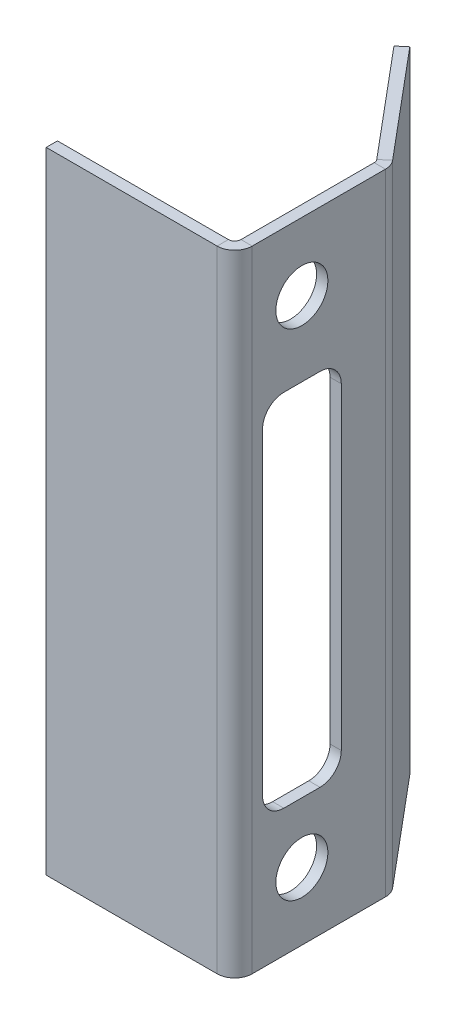
ISO-10303-21;
HEADER;
FILE_DESCRIPTION(('STEP AP214'),'2;1');
FILE_NAME('part.step','',(''),(''),'','','');
FILE_SCHEMA(('AUTOMOTIVE_DESIGN { 1 0 10303 214 1 1 1 1 }'));
ENDSEC;
DATA;
#1=APPLICATION_CONTEXT('core data for automotive mechanical design processes');
#2=APPLICATION_PROTOCOL_DEFINITION('international standard','automotive_design',2000,#1);
#3=PRODUCT_CONTEXT('',#1,'mechanical');
#4=PRODUCT('Part','Part','',(#3));
#5=PRODUCT_RELATED_PRODUCT_CATEGORY('part','',(#4));
#6=PRODUCT_DEFINITION_FORMATION('','',#4);
#7=PRODUCT_DEFINITION_CONTEXT('part definition',#1,'design');
#8=PRODUCT_DEFINITION('design','',#6,#7);
#9=PRODUCT_DEFINITION_SHAPE('','',#8);
#10=(LENGTH_UNIT() NAMED_UNIT(*) SI_UNIT(.MILLI.,.METRE.));
#11=(NAMED_UNIT(*) PLANE_ANGLE_UNIT() SI_UNIT($,.RADIAN.));
#12=(NAMED_UNIT(*) SI_UNIT($,.STERADIAN.) SOLID_ANGLE_UNIT());
#13=UNCERTAINTY_MEASURE_WITH_UNIT(LENGTH_MEASURE(1.E-05),#10,'distance_accuracy_value','');
#14=(GEOMETRIC_REPRESENTATION_CONTEXT(3) GLOBAL_UNCERTAINTY_ASSIGNED_CONTEXT((#13)) GLOBAL_UNIT_ASSIGNED_CONTEXT((#10,
#11,#12)) REPRESENTATION_CONTEXT('',''));
#15=CARTESIAN_POINT('',(0.,0.,0.));
#16=DIRECTION('',(0.,0.,1.));
#17=DIRECTION('',(1.,0.,0.));
#18=AXIS2_PLACEMENT_3D('',#15,#16,#17);
#19=CARTESIAN_POINT('',(25.,88.9,-0.889));
#20=DIRECTION('',(0.,1.,0.));
#21=DIRECTION('',(0.,0.,1.));
#22=AXIS2_PLACEMENT_3D('',#19,#20,#21);
#23=PLANE('',#22);
#24=DIRECTION('',(1.,0.,0.));
#25=VECTOR('',#24,1.);
#26=CARTESIAN_POINT('',(25.,88.9,-0.889));
#27=LINE('',#26,#25);
#28=CARTESIAN_POINT('',(25.,88.9,-0.889));
#29=VERTEX_POINT('',#28);
#30=CARTESIAN_POINT('',(26.5875,88.9,-0.889));
#31=VERTEX_POINT('',#30);
#32=EDGE_CURVE('E312',#29,#31,#27,.T.);
#33=ORIENTED_EDGE('',*,*,#32,.F.);
#34=CARTESIAN_POINT('',(24.111,88.9,-0.889));
#35=DIRECTION('',(0.,-1.,0.));
#36=DIRECTION('',(0.,0.,-1.));
#37=AXIS2_PLACEMENT_3D('',#34,#35,#36);
#38=CIRCLE('',#37,0.889);
#39=CARTESIAN_POINT('',(24.111,88.9,0.));
#40=VERTEX_POINT('',#39);
#41=EDGE_CURVE('E219',#40,#29,#38,.F.);
#42=ORIENTED_EDGE('',*,*,#41,.F.);
#43=DIRECTION('',(0.,0.,-1.));
#44=VECTOR('',#43,1.);
#45=CARTESIAN_POINT('',(24.111,88.9,1.5875));
#46=LINE('',#45,#44);
#47=CARTESIAN_POINT('',(24.111,88.9,1.5875));
#48=VERTEX_POINT('',#47);
#49=EDGE_CURVE('E310',#48,#40,#46,.T.);
#50=ORIENTED_EDGE('',*,*,#49,.F.);
#51=CARTESIAN_POINT('',(24.111,88.9,-0.889));
#52=DIRECTION('',(0.,1.,0.));
#53=DIRECTION('',(1.,0.,0.));
#54=AXIS2_PLACEMENT_3D('',#51,#52,#53);
#55=CIRCLE('',#54,2.4765);
#56=EDGE_CURVE('E231',#48,#31,#55,.T.);
#57=ORIENTED_EDGE('',*,*,#56,.T.);
#58=EDGE_LOOP('',(#33,#42,#50,#57));
#59=FACE_BOUND('',#58,.T.);
#60=ADVANCED_FACE('F45',(#59),#23,.T.);
#61=CARTESIAN_POINT('',(24.111,88.9,1.5875));
#62=DIRECTION('',(0.,1.,0.));
#63=DIRECTION('',(0.,0.,1.));
#64=AXIS2_PLACEMENT_3D('',#61,#62,#63);
#65=PLANE('',#64);
#66=DIRECTION('',(0.,0.,-1.));
#67=VECTOR('',#66,1.);
#68=CARTESIAN_POINT('',(25.,88.9,0.));
#69=LINE('',#68,#67);
#70=CARTESIAN_POINT('',(25.,88.9,-19.6764304617373));
#71=VERTEX_POINT('',#70);
#72=EDGE_CURVE('E216',#29,#71,#69,.T.);
#73=ORIENTED_EDGE('',*,*,#72,.F.);
#74=ORIENTED_EDGE('',*,*,#32,.T.);
#75=DIRECTION('',(0.,0.,-1.));
#76=VECTOR('',#75,1.);
#77=CARTESIAN_POINT('',(26.5875,88.9,0.));
#78=LINE('',#77,#76);
#79=CARTESIAN_POINT('',(26.5875,88.9,-19.6764304617373));
#80=VERTEX_POINT('',#79);
#81=EDGE_CURVE('E234',#31,#80,#78,.T.);
#82=ORIENTED_EDGE('',*,*,#81,.T.);
#83=DIRECTION('',(-1.,0.,0.));
#84=VECTOR('',#83,1.);
#85=CARTESIAN_POINT('',(26.5875,88.9,-19.6764304617373));
#86=LINE('',#85,#84);
#87=EDGE_CURVE('E303',#80,#71,#86,.T.);
#88=ORIENTED_EDGE('',*,*,#87,.T.);
#89=EDGE_LOOP('',(#73,#74,#82,#88));
#90=FACE_BOUND('',#89,.T.);
#91=ADVANCED_FACE('F419',(#90),#65,.T.);
#92=CARTESIAN_POINT('',(24.111,0.,0.));
#93=DIRECTION('',(0.,-1.,0.));
#94=DIRECTION('',(0.,0.,-1.));
#95=AXIS2_PLACEMENT_3D('',#92,#93,#94);
#96=PLANE('',#95);
#97=DIRECTION('',(0.,0.,1.));
#98=VECTOR('',#97,1.);
#99=CARTESIAN_POINT('',(24.111,0.,0.));
#100=LINE('',#99,#98);
#101=CARTESIAN_POINT('',(24.111,0.,0.));
#102=VERTEX_POINT('',#101);
#103=CARTESIAN_POINT('',(24.111,0.,1.5875));
#104=VERTEX_POINT('',#103);
#105=EDGE_CURVE('E308',#102,#104,#100,.T.);
#106=ORIENTED_EDGE('',*,*,#105,.F.);
#107=CARTESIAN_POINT('',(24.111,0.,-0.889));
#108=DIRECTION('',(0.,-1.,0.));
#109=DIRECTION('',(0.,0.,-1.));
#110=AXIS2_PLACEMENT_3D('',#107,#108,#109);
#111=CIRCLE('',#110,0.889);
#112=CARTESIAN_POINT('',(25.,0.,-0.889));
#113=VERTEX_POINT('',#112);
#114=EDGE_CURVE('E253',#102,#113,#111,.F.);
#115=ORIENTED_EDGE('',*,*,#114,.T.);
#116=DIRECTION('',(-1.,0.,0.));
#117=VECTOR('',#116,1.);
#118=CARTESIAN_POINT('',(26.5875,0.,-0.889));
#119=LINE('',#118,#117);
#120=CARTESIAN_POINT('',(26.5875,0.,-0.889));
#121=VERTEX_POINT('',#120);
#122=EDGE_CURVE('E306',#121,#113,#119,.T.);
#123=ORIENTED_EDGE('',*,*,#122,.F.);
#124=CARTESIAN_POINT('',(24.111,0.,-0.889));
#125=DIRECTION('',(0.,1.,0.));
#126=DIRECTION('',(1.,0.,0.));
#127=AXIS2_PLACEMENT_3D('',#124,#125,#126);
#128=CIRCLE('',#127,2.4765);
#129=EDGE_CURVE('E265',#104,#121,#128,.T.);
#130=ORIENTED_EDGE('',*,*,#129,.F.);
#131=EDGE_LOOP('',(#106,#115,#123,#130));
#132=FACE_BOUND('',#131,.T.);
#133=ADVANCED_FACE('F425',(#132),#96,.T.);
#134=CARTESIAN_POINT('',(26.5875,0.,-0.889));
#135=DIRECTION('',(0.,-1.,0.));
#136=DIRECTION('',(0.,0.,-1.));
#137=AXIS2_PLACEMENT_3D('',#134,#135,#136);
#138=PLANE('',#137);
#139=DIRECTION('',(1.,0.,0.));
#140=VECTOR('',#139,1.);
#141=CARTESIAN_POINT('',(0.,0.,0.));
#142=LINE('',#141,#140);
#143=CARTESIAN_POINT('',(0.,0.,0.));
#144=VERTEX_POINT('',#143);
#145=EDGE_CURVE('E256',#144,#102,#142,.T.);
#146=ORIENTED_EDGE('',*,*,#145,.T.);
#147=ORIENTED_EDGE('',*,*,#105,.T.);
#148=DIRECTION('',(1.,0.,0.));
#149=VECTOR('',#148,1.);
#150=CARTESIAN_POINT('',(0.,0.,1.5875));
#151=LINE('',#150,#149);
#152=CARTESIAN_POINT('',(0.,0.,1.5875));
#153=VERTEX_POINT('',#152);
#154=EDGE_CURVE('E262',#153,#104,#151,.T.);
#155=ORIENTED_EDGE('',*,*,#154,.F.);
#156=DIRECTION('',(0.,0.,-1.));
#157=VECTOR('',#156,1.);
#158=CARTESIAN_POINT('',(0.,0.,1.5875));
#159=LINE('',#158,#157);
#160=EDGE_CURVE('E259',#153,#144,#159,.T.);
#161=ORIENTED_EDGE('',*,*,#160,.T.);
#162=EDGE_LOOP('',(#146,#147,#155,#161));
#163=FACE_BOUND('',#162,.T.);
#164=ADVANCED_FACE('F501',(#163),#138,.T.);
#165=CARTESIAN_POINT('',(24.7920135099328,88.9,-20.2478686467487));
#166=DIRECTION('',(0.,1.,0.));
#167=DIRECTION('',(0.,0.,1.));
#168=AXIS2_PLACEMENT_3D('',#165,#166,#167);
#169=PLANE('',#168);
#170=DIRECTION('',(0.766044443118977,0.,-0.642787609686541));
#171=VECTOR('',#170,1.);
#172=CARTESIAN_POINT('',(24.7920135099328,88.9,-20.2478686467487));
#173=LINE('',#172,#171);
#174=CARTESIAN_POINT('',(24.7920135099328,88.9,-20.2478686467487));
#175=VERTEX_POINT('',#174);
#176=CARTESIAN_POINT('',(26.0081090633841,88.9,-21.2682939771261));
#177=VERTEX_POINT('',#176);
#178=EDGE_CURVE('E190',#175,#177,#173,.T.);
#179=ORIENTED_EDGE('',*,*,#178,.F.);
#180=CARTESIAN_POINT('',(24.111,88.9,-19.6764304617373));
#181=DIRECTION('',(0.,-1.,0.));
#182=DIRECTION('',(0.,0.,-1.));
#183=AXIS2_PLACEMENT_3D('',#180,#181,#182);
#184=CIRCLE('',#183,0.889);
#185=EDGE_CURVE('E210',#71,#175,#184,.F.);
#186=ORIENTED_EDGE('',*,*,#185,.F.);
#187=ORIENTED_EDGE('',*,*,#87,.F.);
#188=CARTESIAN_POINT('',(24.111,88.9,-19.6764304617373));
#189=DIRECTION('',(0.,1.,0.));
#190=DIRECTION('',(1.,0.,0.));
#191=AXIS2_PLACEMENT_3D('',#188,#189,#190);
#192=CIRCLE('',#191,2.4765);
#193=EDGE_CURVE('E237',#80,#177,#192,.T.);
#194=ORIENTED_EDGE('',*,*,#193,.T.);
#195=EDGE_LOOP('',(#179,#186,#187,#194));
#196=FACE_BOUND('',#195,.T.);
#197=ADVANCED_FACE('F518',(#196),#169,.T.);
#198=CARTESIAN_POINT('',(26.5875,88.9,-19.6764304617373));
#199=DIRECTION('',(0.,1.,0.));
#200=DIRECTION('',(0.,0.,1.));
#201=AXIS2_PLACEMENT_3D('',#198,#199,#200);
#202=PLANE('',#201);
#203=DIRECTION('',(-0.64278760968654,0.,-0.766044443118977));
#204=VECTOR('',#203,1.);
#205=CARTESIAN_POINT('',(25.,88.9,-20.));
#206=LINE('',#205,#204);
#207=CARTESIAN_POINT('',(12.1442478062692,88.9,-35.3208888623796));
#208=VERTEX_POINT('',#207);
#209=EDGE_CURVE('E208',#175,#208,#206,.T.);
#210=ORIENTED_EDGE('',*,*,#209,.F.);
#211=ORIENTED_EDGE('',*,*,#178,.T.);
#212=DIRECTION('',(-0.64278760968654,0.,-0.766044443118977));
#213=VECTOR('',#212,1.);
#214=CARTESIAN_POINT('',(26.2160955534514,88.9,-21.0204253303774));
#215=LINE('',#214,#213);
#216=CARTESIAN_POINT('',(13.3603433597206,88.9,-36.3413141927569));
#217=VERTEX_POINT('',#216);
#218=EDGE_CURVE('E183',#177,#217,#215,.T.);
#219=ORIENTED_EDGE('',*,*,#218,.T.);
#220=DIRECTION('',(0.766044443118973,0.,-0.642787609686545));
#221=VECTOR('',#220,1.);
#222=CARTESIAN_POINT('',(12.1442478062692,88.9,-35.3208888623796));
#223=LINE('',#222,#221);
#224=EDGE_CURVE('E188',#208,#217,#223,.T.);
#225=ORIENTED_EDGE('',*,*,#224,.F.);
#226=EDGE_LOOP('',(#210,#211,#219,#225));
#227=FACE_BOUND('',#226,.T.);
#228=ADVANCED_FACE('F186',(#227),#202,.T.);
#229=CARTESIAN_POINT('',(25.,0.,-19.6764304617373));
#230=DIRECTION('',(0.,-1.,0.));
#231=DIRECTION('',(0.,0.,-1.));
#232=AXIS2_PLACEMENT_3D('',#229,#230,#231);
#233=PLANE('',#232);
#234=DIRECTION('',(1.,0.,0.));
#235=VECTOR('',#234,1.);
#236=CARTESIAN_POINT('',(25.,0.,-19.6764304617373));
#237=LINE('',#236,#235);
#238=CARTESIAN_POINT('',(25.,0.,-19.6764304617373));
#239=VERTEX_POINT('',#238);
#240=CARTESIAN_POINT('',(26.5875,0.,-19.6764304617373));
#241=VERTEX_POINT('',#240);
#242=EDGE_CURVE('E301',#239,#241,#237,.T.);
#243=ORIENTED_EDGE('',*,*,#242,.F.);
#244=CARTESIAN_POINT('',(24.111,0.,-19.6764304617373));
#245=DIRECTION('',(0.,-1.,0.));
#246=DIRECTION('',(0.,0.,-1.));
#247=AXIS2_PLACEMENT_3D('',#244,#245,#246);
#248=CIRCLE('',#247,0.889);
#249=CARTESIAN_POINT('',(24.7920135099328,0.,-20.2478686467487));
#250=VERTEX_POINT('',#249);
#251=EDGE_CURVE('E247',#239,#250,#248,.F.);
#252=ORIENTED_EDGE('',*,*,#251,.T.);
#253=DIRECTION('',(-0.766044443118977,0.,0.642787609686541));
#254=VECTOR('',#253,1.);
#255=CARTESIAN_POINT('',(26.0081090633841,0.,-21.2682939771261));
#256=LINE('',#255,#254);
#257=CARTESIAN_POINT('',(26.0081090633841,0.,-21.2682939771261));
#258=VERTEX_POINT('',#257);
#259=EDGE_CURVE('E204',#258,#250,#256,.T.);
#260=ORIENTED_EDGE('',*,*,#259,.F.);
#261=CARTESIAN_POINT('',(24.111,0.,-19.6764304617373));
#262=DIRECTION('',(0.,1.,0.));
#263=DIRECTION('',(1.,0.,0.));
#264=AXIS2_PLACEMENT_3D('',#261,#262,#263);
#265=CIRCLE('',#264,2.4765);
#266=EDGE_CURVE('E194',#241,#258,#265,.T.);
#267=ORIENTED_EDGE('',*,*,#266,.F.);
#268=EDGE_LOOP('',(#243,#252,#260,#267));
#269=FACE_BOUND('',#268,.T.);
#270=ADVANCED_FACE('F480',(#269),#233,.T.);
#271=CARTESIAN_POINT('',(26.0081090633841,0.,-21.2682939771261));
#272=DIRECTION('',(0.,-1.,0.));
#273=DIRECTION('',(0.,0.,-1.));
#274=AXIS2_PLACEMENT_3D('',#271,#272,#273);
#275=PLANE('',#274);
#276=DIRECTION('',(0.,0.,-1.));
#277=VECTOR('',#276,1.);
#278=CARTESIAN_POINT('',(25.,0.,0.));
#279=LINE('',#278,#277);
#280=EDGE_CURVE('E250',#113,#239,#279,.T.);
#281=ORIENTED_EDGE('',*,*,#280,.T.);
#282=ORIENTED_EDGE('',*,*,#242,.T.);
#283=DIRECTION('',(0.,0.,-1.));
#284=VECTOR('',#283,1.);
#285=CARTESIAN_POINT('',(26.5875,0.,0.));
#286=LINE('',#285,#284);
#287=EDGE_CURVE('E268',#121,#241,#286,.T.);
#288=ORIENTED_EDGE('',*,*,#287,.F.);
#289=ORIENTED_EDGE('',*,*,#122,.T.);
#290=EDGE_LOOP('',(#281,#282,#288,#289));
#291=FACE_BOUND('',#290,.T.);
#292=ADVANCED_FACE('F488',(#291),#275,.T.);
#293=CARTESIAN_POINT('',(26.2160955534514,88.9,-21.0204253303774));
#294=DIRECTION('',(-0.766044443118977,0.,0.64278760968654));
#295=DIRECTION('',(0.64278760968654,0.,0.766044443118977));
#296=AXIS2_PLACEMENT_3D('',#293,#294,#295);
#297=PLANE('',#296);
#298=DIRECTION('',(-0.64278760968654,0.,-0.766044443118977));
#299=VECTOR('',#298,1.);
#300=CARTESIAN_POINT('',(26.2160955534514,0.,-21.0204253303774));
#301=LINE('',#300,#299);
#302=CARTESIAN_POINT('',(13.3603433597206,0.,-36.3413141927569));
#303=VERTEX_POINT('',#302);
#304=EDGE_CURVE('E200',#258,#303,#301,.T.);
#305=ORIENTED_EDGE('',*,*,#304,.T.);
#306=DIRECTION('',(0.,-1.,0.));
#307=VECTOR('',#306,1.);
#308=CARTESIAN_POINT('',(13.3603433597206,88.9,-36.3413141927569));
#309=LINE('',#308,#307);
#310=EDGE_CURVE('E197',#217,#303,#309,.T.);
#311=ORIENTED_EDGE('',*,*,#310,.F.);
#312=ORIENTED_EDGE('',*,*,#218,.F.);
#313=DIRECTION('',(0.,-1.,0.));
#314=VECTOR('',#313,1.);
#315=CARTESIAN_POINT('',(26.0081090633841,88.9,-21.2682939771261));
#316=LINE('',#315,#314);
#317=EDGE_CURVE('E239',#177,#258,#316,.T.);
#318=ORIENTED_EDGE('',*,*,#317,.T.);
#319=EDGE_LOOP('',(#305,#311,#312,#318));
#320=FACE_BOUND('',#319,.T.);
#321=ADVANCED_FACE('F198',(#320),#297,.F.);
#322=CARTESIAN_POINT('',(12.1442478062692,88.9,-35.3208888623796));
#323=DIRECTION('',(-0.642787609686545,0.,-0.766044443118973));
#324=DIRECTION('',(-0.766044443118973,0.,0.642787609686545));
#325=AXIS2_PLACEMENT_3D('',#322,#323,#324);
#326=PLANE('',#325);
#327=DIRECTION('',(0.766044443118973,0.,-0.642787609686545));
#328=VECTOR('',#327,1.);
#329=CARTESIAN_POINT('',(12.1442478062692,0.,-35.3208888623796));
#330=LINE('',#329,#328);
#331=CARTESIAN_POINT('',(12.1442478062692,0.,-35.3208888623796));
#332=VERTEX_POINT('',#331);
#333=EDGE_CURVE('E241',#332,#303,#330,.T.);
#334=ORIENTED_EDGE('',*,*,#333,.F.);
#335=DIRECTION('',(0.,-1.,0.));
#336=VECTOR('',#335,1.);
#337=CARTESIAN_POINT('',(12.1442478062692,88.9,-35.3208888623796));
#338=LINE('',#337,#336);
#339=EDGE_CURVE('E205',#208,#332,#338,.T.);
#340=ORIENTED_EDGE('',*,*,#339,.F.);
#341=ORIENTED_EDGE('',*,*,#224,.T.);
#342=ORIENTED_EDGE('',*,*,#310,.T.);
#343=EDGE_LOOP('',(#334,#340,#341,#342));
#344=FACE_BOUND('',#343,.T.);
#345=ADVANCED_FACE('F207',(#344),#326,.T.);
#346=CARTESIAN_POINT('',(25.,88.9,-20.));
#347=DIRECTION('',(-0.766044443118977,0.,0.64278760968654));
#348=DIRECTION('',(0.64278760968654,0.,0.766044443118977));
#349=AXIS2_PLACEMENT_3D('',#346,#347,#348);
#350=PLANE('',#349);
#351=DIRECTION('',(-0.64278760968654,0.,-0.766044443118977));
#352=VECTOR('',#351,1.);
#353=CARTESIAN_POINT('',(25.,0.,-20.));
#354=LINE('',#353,#352);
#355=EDGE_CURVE('E244',#250,#332,#354,.T.);
#356=ORIENTED_EDGE('',*,*,#355,.F.);
#357=DIRECTION('',(0.,-1.,0.));
#358=VECTOR('',#357,1.);
#359=CARTESIAN_POINT('',(24.7920135099328,88.9,-20.2478686467487));
#360=LINE('',#359,#358);
#361=EDGE_CURVE('E296',#175,#250,#360,.T.);
#362=ORIENTED_EDGE('',*,*,#361,.F.);
#363=ORIENTED_EDGE('',*,*,#209,.T.);
#364=ORIENTED_EDGE('',*,*,#339,.T.);
#365=EDGE_LOOP('',(#356,#362,#363,#364));
#366=FACE_BOUND('',#365,.T.);
#367=ADVANCED_FACE('F477',(#366),#350,.T.);
#368=CARTESIAN_POINT('',(24.111,88.9,-19.6764304617373));
#369=DIRECTION('',(0.,-1.,0.));
#370=DIRECTION('',(0.,0.,-1.));
#371=AXIS2_PLACEMENT_3D('',#368,#369,#370);
#372=CYLINDRICAL_SURFACE('',#371,0.889);
#373=ORIENTED_EDGE('',*,*,#251,.F.);
#374=DIRECTION('',(0.,-1.,0.));
#375=VECTOR('',#374,1.);
#376=CARTESIAN_POINT('',(25.,88.9,-19.6764304617373));
#377=LINE('',#376,#375);
#378=EDGE_CURVE('E293',#71,#239,#377,.T.);
#379=ORIENTED_EDGE('',*,*,#378,.F.);
#380=ORIENTED_EDGE('',*,*,#185,.T.);
#381=ORIENTED_EDGE('',*,*,#361,.T.);
#382=EDGE_LOOP('',(#373,#379,#380,#381));
#383=FACE_BOUND('',#382,.T.);
#384=ADVANCED_FACE('F484',(#383),#372,.F.);
#385=CARTESIAN_POINT('',(25.,88.9,0.));
#386=DIRECTION('',(-1.,0.,0.));
#387=DIRECTION('',(0.,0.,1.));
#388=AXIS2_PLACEMENT_3D('',#385,#386,#387);
#389=PLANE('',#388);
#390=CARTESIAN_POINT('',(25.,79.35,-7.889));
#391=DIRECTION('',(-1.,0.,0.));
#392=DIRECTION('',(0.,0.,1.));
#393=AXIS2_PLACEMENT_3D('',#390,#391,#392);
#394=CIRCLE('',#393,3.66775026423711);
#395=CARTESIAN_POINT('',(25.,79.35,-4.22124973576289));
#396=VERTEX_POINT('',#395);
#397=EDGE_CURVE('E390',#396,#396,#394,.F.);
#398=ORIENTED_EDGE('',*,*,#397,.T.);
#399=EDGE_LOOP('',(#398));
#400=FACE_BOUND('',#399,.T.);
#401=CARTESIAN_POINT('',(25.,9.5,-7.88900000000001));
#402=DIRECTION('',(-1.,0.,0.));
#403=DIRECTION('',(0.,0.,1.));
#404=AXIS2_PLACEMENT_3D('',#401,#402,#403);
#405=CIRCLE('',#404,3.6677502642371);
#406=CARTESIAN_POINT('',(25.,9.5,-4.2212497357629));
#407=VERTEX_POINT('',#406);
#408=EDGE_CURVE('E386',#407,#407,#405,.F.);
#409=ORIENTED_EDGE('',*,*,#408,.T.);
#410=EDGE_LOOP('',(#409));
#411=FACE_BOUND('',#410,.T.);
#412=DIRECTION('',(0.,0.,-1.));
#413=VECTOR('',#412,1.);
#414=CARTESIAN_POINT('',(25.,18.0059352004911,-2.34731461555023));
#415=LINE('',#414,#413);
#416=CARTESIAN_POINT('',(25.,18.0059352004911,-5.34731461555023));
#417=VERTEX_POINT('',#416);
#418=CARTESIAN_POINT('',(25.,18.0059352004911,-10.4471146155502));
#419=VERTEX_POINT('',#418);
#420=EDGE_CURVE('E380',#417,#419,#415,.T.);
#421=ORIENTED_EDGE('',*,*,#420,.T.);
#422=CARTESIAN_POINT('',(25.,21.0059352004911,-10.4471146155502));
#423=DIRECTION('',(-1.,0.,0.));
#424=DIRECTION('',(0.,0.,1.));
#425=AXIS2_PLACEMENT_3D('',#422,#423,#424);
#426=CIRCLE('',#425,3.);
#427=CARTESIAN_POINT('',(25.,21.0059352004911,-13.4471146155502));
#428=VERTEX_POINT('',#427);
#429=EDGE_CURVE('E67',#419,#428,#426,.F.);
#430=ORIENTED_EDGE('',*,*,#429,.T.);
#431=DIRECTION('',(0.,1.,0.));
#432=VECTOR('',#431,1.);
#433=CARTESIAN_POINT('',(25.,18.0059352004911,-13.4471146155502));
#434=LINE('',#433,#432);
#435=CARTESIAN_POINT('',(25.,65.805935200491,-13.4471146155502));
#436=VERTEX_POINT('',#435);
#437=EDGE_CURVE('E355',#428,#436,#434,.T.);
#438=ORIENTED_EDGE('',*,*,#437,.T.);
#439=CARTESIAN_POINT('',(25.,65.805935200491,-10.4471146155502));
#440=DIRECTION('',(-1.,0.,0.));
#441=DIRECTION('',(0.,0.,1.));
#442=AXIS2_PLACEMENT_3D('',#439,#440,#441);
#443=CIRCLE('',#442,3.);
#444=CARTESIAN_POINT('',(25.,68.805935200491,-10.4471146155502));
#445=VERTEX_POINT('',#444);
#446=EDGE_CURVE('E11',#436,#445,#443,.F.);
#447=ORIENTED_EDGE('',*,*,#446,.T.);
#448=DIRECTION('',(0.,0.,1.));
#449=VECTOR('',#448,1.);
#450=CARTESIAN_POINT('',(25.,68.805935200491,-2.34731461555023));
#451=LINE('',#450,#449);
#452=CARTESIAN_POINT('',(25.,68.805935200491,-5.34731461555023));
#453=VERTEX_POINT('',#452);
#454=EDGE_CURVE('E362',#445,#453,#451,.T.);
#455=ORIENTED_EDGE('',*,*,#454,.T.);
#456=CARTESIAN_POINT('',(25.,65.805935200491,-5.34731461555023));
#457=DIRECTION('',(-1.,0.,0.));
#458=DIRECTION('',(0.,0.,1.));
#459=AXIS2_PLACEMENT_3D('',#456,#457,#458);
#460=CIRCLE('',#459,3.);
#461=CARTESIAN_POINT('',(25.,65.805935200491,-2.34731461555023));
#462=VERTEX_POINT('',#461);
#463=EDGE_CURVE('E339',#453,#462,#460,.F.);
#464=ORIENTED_EDGE('',*,*,#463,.T.);
#465=DIRECTION('',(0.,-1.,0.));
#466=VECTOR('',#465,1.);
#467=CARTESIAN_POINT('',(25.,18.0059352004911,-2.34731461555023));
#468=LINE('',#467,#466);
#469=CARTESIAN_POINT('',(25.,21.0059352004911,-2.34731461555023));
#470=VERTEX_POINT('',#469);
#471=EDGE_CURVE('E381',#462,#470,#468,.T.);
#472=ORIENTED_EDGE('',*,*,#471,.T.);
#473=CARTESIAN_POINT('',(25.,21.0059352004911,-5.34731461555023));
#474=DIRECTION('',(-1.,0.,0.));
#475=DIRECTION('',(0.,0.,1.));
#476=AXIS2_PLACEMENT_3D('',#473,#474,#475);
#477=CIRCLE('',#476,3.);
#478=EDGE_CURVE('E335',#470,#417,#477,.F.);
#479=ORIENTED_EDGE('',*,*,#478,.T.);
#480=EDGE_LOOP('',(#421,#430,#438,#447,#455,#464,#472,#479));
#481=FACE_BOUND('',#480,.T.);
#482=ORIENTED_EDGE('',*,*,#280,.F.);
#483=DIRECTION('',(0.,-1.,0.));
#484=VECTOR('',#483,1.);
#485=CARTESIAN_POINT('',(25.,88.9,-0.889));
#486=LINE('',#485,#484);
#487=EDGE_CURVE('E290',#29,#113,#486,.T.);
#488=ORIENTED_EDGE('',*,*,#487,.F.);
#489=ORIENTED_EDGE('',*,*,#72,.T.);
#490=ORIENTED_EDGE('',*,*,#378,.T.);
#491=EDGE_LOOP('',(#482,#488,#489,#490));
#492=FACE_BOUND('',#491,.T.);
#493=ADVANCED_FACE('F360',(#400,#411,#481,#492),#389,.T.);
#494=CARTESIAN_POINT('',(24.111,88.9,-0.889));
#495=DIRECTION('',(0.,-1.,0.));
#496=DIRECTION('',(0.,0.,-1.));
#497=AXIS2_PLACEMENT_3D('',#494,#495,#496);
#498=CYLINDRICAL_SURFACE('',#497,0.889);
#499=ORIENTED_EDGE('',*,*,#114,.F.);
#500=DIRECTION('',(0.,-1.,0.));
#501=VECTOR('',#500,1.);
#502=CARTESIAN_POINT('',(24.111,88.9,0.));
#503=LINE('',#502,#501);
#504=EDGE_CURVE('E287',#40,#102,#503,.T.);
#505=ORIENTED_EDGE('',*,*,#504,.F.);
#506=ORIENTED_EDGE('',*,*,#41,.T.);
#507=ORIENTED_EDGE('',*,*,#487,.T.);
#508=EDGE_LOOP('',(#499,#505,#506,#507));
#509=FACE_BOUND('',#508,.T.);
#510=ADVANCED_FACE('F497',(#509),#498,.F.);
#511=CARTESIAN_POINT('',(0.,88.9,0.));
#512=DIRECTION('',(0.,0.,-1.));
#513=DIRECTION('',(-1.,0.,0.));
#514=AXIS2_PLACEMENT_3D('',#511,#512,#513);
#515=PLANE('',#514);
#516=ORIENTED_EDGE('',*,*,#145,.F.);
#517=DIRECTION('',(0.,-1.,0.));
#518=VECTOR('',#517,1.);
#519=CARTESIAN_POINT('',(0.,88.9,0.));
#520=LINE('',#519,#518);
#521=CARTESIAN_POINT('',(0.,88.9,0.));
#522=VERTEX_POINT('',#521);
#523=EDGE_CURVE('E285',#522,#144,#520,.T.);
#524=ORIENTED_EDGE('',*,*,#523,.F.);
#525=DIRECTION('',(1.,0.,0.));
#526=VECTOR('',#525,1.);
#527=CARTESIAN_POINT('',(0.,88.9,0.));
#528=LINE('',#527,#526);
#529=EDGE_CURVE('E222',#522,#40,#528,.T.);
#530=ORIENTED_EDGE('',*,*,#529,.T.);
#531=ORIENTED_EDGE('',*,*,#504,.T.);
#532=EDGE_LOOP('',(#516,#524,#530,#531));
#533=FACE_BOUND('',#532,.T.);
#534=ADVANCED_FACE('F505',(#533),#515,.T.);
#535=CARTESIAN_POINT('',(0.,88.9,1.5875));
#536=DIRECTION('',(-1.,0.,0.));
#537=DIRECTION('',(0.,0.,1.));
#538=AXIS2_PLACEMENT_3D('',#535,#536,#537);
#539=PLANE('',#538);
#540=ORIENTED_EDGE('',*,*,#160,.F.);
#541=DIRECTION('',(0.,-1.,0.));
#542=VECTOR('',#541,1.);
#543=CARTESIAN_POINT('',(0.,88.9,1.5875));
#544=LINE('',#543,#542);
#545=CARTESIAN_POINT('',(0.,88.9,1.5875));
#546=VERTEX_POINT('',#545);
#547=EDGE_CURVE('E283',#546,#153,#544,.T.);
#548=ORIENTED_EDGE('',*,*,#547,.F.);
#549=DIRECTION('',(0.,0.,-1.));
#550=VECTOR('',#549,1.);
#551=CARTESIAN_POINT('',(0.,88.9,1.5875));
#552=LINE('',#551,#550);
#553=EDGE_CURVE('E225',#546,#522,#552,.T.);
#554=ORIENTED_EDGE('',*,*,#553,.T.);
#555=ORIENTED_EDGE('',*,*,#523,.T.);
#556=EDGE_LOOP('',(#540,#548,#554,#555));
#557=FACE_BOUND('',#556,.T.);
#558=ADVANCED_FACE('F509',(#557),#539,.T.);
#559=CARTESIAN_POINT('',(0.,88.9,1.5875));
#560=DIRECTION('',(0.,0.,-1.));
#561=DIRECTION('',(-1.,0.,0.));
#562=AXIS2_PLACEMENT_3D('',#559,#560,#561);
#563=PLANE('',#562);
#564=ORIENTED_EDGE('',*,*,#154,.T.);
#565=DIRECTION('',(0.,-1.,0.));
#566=VECTOR('',#565,1.);
#567=CARTESIAN_POINT('',(24.111,88.9,1.5875));
#568=LINE('',#567,#566);
#569=EDGE_CURVE('E280',#48,#104,#568,.T.);
#570=ORIENTED_EDGE('',*,*,#569,.F.);
#571=DIRECTION('',(1.,0.,0.));
#572=VECTOR('',#571,1.);
#573=CARTESIAN_POINT('',(0.,88.9,1.5875));
#574=LINE('',#573,#572);
#575=EDGE_CURVE('E228',#546,#48,#574,.T.);
#576=ORIENTED_EDGE('',*,*,#575,.F.);
#577=ORIENTED_EDGE('',*,*,#547,.T.);
#578=EDGE_LOOP('',(#564,#570,#576,#577));
#579=FACE_BOUND('',#578,.T.);
#580=ADVANCED_FACE('F415',(#579),#563,.F.);
#581=CARTESIAN_POINT('',(24.111,88.9,-0.889));
#582=DIRECTION('',(0.,-1.,0.));
#583=DIRECTION('',(0.,0.,-1.));
#584=AXIS2_PLACEMENT_3D('',#581,#582,#583);
#585=CYLINDRICAL_SURFACE('',#584,2.4765);
#586=ORIENTED_EDGE('',*,*,#129,.T.);
#587=DIRECTION('',(0.,-1.,0.));
#588=VECTOR('',#587,1.);
#589=CARTESIAN_POINT('',(26.5875,88.9,-0.889));
#590=LINE('',#589,#588);
#591=EDGE_CURVE('E277',#31,#121,#590,.T.);
#592=ORIENTED_EDGE('',*,*,#591,.F.);
#593=ORIENTED_EDGE('',*,*,#56,.F.);
#594=ORIENTED_EDGE('',*,*,#569,.T.);
#595=EDGE_LOOP('',(#586,#592,#593,#594));
#596=FACE_BOUND('',#595,.T.);
#597=ADVANCED_FACE('F404',(#596),#585,.T.);
#598=CARTESIAN_POINT('',(26.5875,88.9,0.));
#599=DIRECTION('',(-1.,0.,0.));
#600=DIRECTION('',(0.,0.,1.));
#601=AXIS2_PLACEMENT_3D('',#598,#599,#600);
#602=PLANE('',#601);
#603=CARTESIAN_POINT('',(26.5875,79.35,-7.889));
#604=DIRECTION('',(1.,0.,0.));
#605=DIRECTION('',(0.,0.,-1.));
#606=AXIS2_PLACEMENT_3D('',#603,#604,#605);
#607=CIRCLE('',#606,3.66775026423711);
#608=CARTESIAN_POINT('',(26.5875,79.35,-11.5567502642371));
#609=VERTEX_POINT('',#608);
#610=EDGE_CURVE('E242',#609,#609,#607,.T.);
#611=ORIENTED_EDGE('',*,*,#610,.F.);
#612=EDGE_LOOP('',(#611));
#613=FACE_BOUND('',#612,.T.);
#614=CARTESIAN_POINT('',(26.5875,9.5,-7.88900000000001));
#615=DIRECTION('',(1.,0.,0.));
#616=DIRECTION('',(0.,0.,-1.));
#617=AXIS2_PLACEMENT_3D('',#614,#615,#616);
#618=CIRCLE('',#617,3.6677502642371);
#619=CARTESIAN_POINT('',(26.5875,9.5,-11.5567502642371));
#620=VERTEX_POINT('',#619);
#621=EDGE_CURVE('E373',#620,#620,#618,.T.);
#622=ORIENTED_EDGE('',*,*,#621,.F.);
#623=EDGE_LOOP('',(#622));
#624=FACE_BOUND('',#623,.T.);
#625=DIRECTION('',(0.,0.,1.));
#626=VECTOR('',#625,1.);
#627=CARTESIAN_POINT('',(26.5875,68.805935200491,-2.34731461555023));
#628=LINE('',#627,#626);
#629=CARTESIAN_POINT('',(26.5875,68.805935200491,-10.4471146155502));
#630=VERTEX_POINT('',#629);
#631=CARTESIAN_POINT('',(26.5875,68.805935200491,-5.34731461555023));
#632=VERTEX_POINT('',#631);
#633=EDGE_CURVE('E350',#630,#632,#628,.T.);
#634=ORIENTED_EDGE('',*,*,#633,.F.);
#635=CARTESIAN_POINT('',(26.5875,65.805935200491,-10.4471146155502));
#636=DIRECTION('',(-1.,0.,0.));
#637=DIRECTION('',(0.,0.,1.));
#638=AXIS2_PLACEMENT_3D('',#635,#636,#637);
#639=CIRCLE('',#638,3.);
#640=CARTESIAN_POINT('',(26.5875,65.805935200491,-13.4471146155502));
#641=VERTEX_POINT('',#640);
#642=EDGE_CURVE('E53',#630,#641,#639,.T.);
#643=ORIENTED_EDGE('',*,*,#642,.T.);
#644=DIRECTION('',(0.,1.,0.));
#645=VECTOR('',#644,1.);
#646=CARTESIAN_POINT('',(26.5875,18.0059352004911,-13.4471146155502));
#647=LINE('',#646,#645);
#648=CARTESIAN_POINT('',(26.5875,21.0059352004911,-13.4471146155502));
#649=VERTEX_POINT('',#648);
#650=EDGE_CURVE('E348',#649,#641,#647,.T.);
#651=ORIENTED_EDGE('',*,*,#650,.F.);
#652=CARTESIAN_POINT('',(26.5875,21.0059352004911,-10.4471146155502));
#653=DIRECTION('',(-1.,0.,0.));
#654=DIRECTION('',(0.,0.,1.));
#655=AXIS2_PLACEMENT_3D('',#652,#653,#654);
#656=CIRCLE('',#655,3.);
#657=CARTESIAN_POINT('',(26.5875,18.0059352004911,-10.4471146155502));
#658=VERTEX_POINT('',#657);
#659=EDGE_CURVE('E341',#649,#658,#656,.T.);
#660=ORIENTED_EDGE('',*,*,#659,.T.);
#661=DIRECTION('',(0.,0.,-1.));
#662=VECTOR('',#661,1.);
#663=CARTESIAN_POINT('',(26.5875,18.0059352004911,-2.34731461555023));
#664=LINE('',#663,#662);
#665=CARTESIAN_POINT('',(26.5875,18.0059352004911,-5.34731461555023));
#666=VERTEX_POINT('',#665);
#667=EDGE_CURVE('E367',#666,#658,#664,.T.);
#668=ORIENTED_EDGE('',*,*,#667,.F.);
#669=CARTESIAN_POINT('',(26.5875,21.0059352004911,-5.34731461555023));
#670=DIRECTION('',(-1.,0.,0.));
#671=DIRECTION('',(0.,0.,1.));
#672=AXIS2_PLACEMENT_3D('',#669,#670,#671);
#673=CIRCLE('',#672,3.);
#674=CARTESIAN_POINT('',(26.5875,21.0059352004911,-2.34731461555023));
#675=VERTEX_POINT('',#674);
#676=EDGE_CURVE('E333',#666,#675,#673,.T.);
#677=ORIENTED_EDGE('',*,*,#676,.T.);
#678=DIRECTION('',(0.,-1.,0.));
#679=VECTOR('',#678,1.);
#680=CARTESIAN_POINT('',(26.5875,18.0059352004911,-2.34731461555023));
#681=LINE('',#680,#679);
#682=CARTESIAN_POINT('',(26.5875,65.805935200491,-2.34731461555023));
#683=VERTEX_POINT('',#682);
#684=EDGE_CURVE('E370',#683,#675,#681,.T.);
#685=ORIENTED_EDGE('',*,*,#684,.F.);
#686=CARTESIAN_POINT('',(26.5875,65.805935200491,-5.34731461555023));
#687=DIRECTION('',(-1.,0.,0.));
#688=DIRECTION('',(0.,0.,1.));
#689=AXIS2_PLACEMENT_3D('',#686,#687,#688);
#690=CIRCLE('',#689,3.);
#691=EDGE_CURVE('E337',#683,#632,#690,.T.);
#692=ORIENTED_EDGE('',*,*,#691,.T.);
#693=EDGE_LOOP('',(#634,#643,#651,#660,#668,#677,#685,#692));
#694=FACE_BOUND('',#693,.T.);
#695=ORIENTED_EDGE('',*,*,#287,.T.);
#696=DIRECTION('',(0.,-1.,0.));
#697=VECTOR('',#696,1.);
#698=CARTESIAN_POINT('',(26.5875,88.9,-19.6764304617373));
#699=LINE('',#698,#697);
#700=EDGE_CURVE('E274',#80,#241,#699,.T.);
#701=ORIENTED_EDGE('',*,*,#700,.F.);
#702=ORIENTED_EDGE('',*,*,#81,.F.);
#703=ORIENTED_EDGE('',*,*,#591,.T.);
#704=EDGE_LOOP('',(#695,#701,#702,#703));
#705=FACE_BOUND('',#704,.T.);
#706=ADVANCED_FACE('F346',(#613,#624,#694,#705),#602,.F.);
#707=CARTESIAN_POINT('',(24.111,88.9,-19.6764304617373));
#708=DIRECTION('',(0.,-1.,0.));
#709=DIRECTION('',(0.,0.,-1.));
#710=AXIS2_PLACEMENT_3D('',#707,#708,#709);
#711=CYLINDRICAL_SURFACE('',#710,2.4765);
#712=ORIENTED_EDGE('',*,*,#266,.T.);
#713=ORIENTED_EDGE('',*,*,#317,.F.);
#714=ORIENTED_EDGE('',*,*,#193,.F.);
#715=ORIENTED_EDGE('',*,*,#700,.T.);
#716=EDGE_LOOP('',(#712,#713,#714,#715));
#717=FACE_BOUND('',#716,.T.);
#718=ADVANCED_FACE('F403',(#717),#711,.T.);
#719=CARTESIAN_POINT('',(24.111,88.9,-19.6764304617373));
#720=DIRECTION('',(0.,-1.,0.));
#721=DIRECTION('',(-1.,0.,0.));
#722=AXIS2_PLACEMENT_3D('',#719,#720,#721);
#723=PLANE('',#722);
#724=ORIENTED_EDGE('',*,*,#575,.T.);
#725=ORIENTED_EDGE('',*,*,#49,.T.);
#726=ORIENTED_EDGE('',*,*,#529,.F.);
#727=ORIENTED_EDGE('',*,*,#553,.F.);
#728=EDGE_LOOP('',(#724,#725,#726,#727));
#729=FACE_BOUND('',#728,.T.);
#730=ADVANCED_FACE('F411',(#729),#723,.F.);
#731=CARTESIAN_POINT('',(24.111,0.,-19.6764304617373));
#732=DIRECTION('',(0.,-1.,0.));
#733=DIRECTION('',(-1.,0.,0.));
#734=AXIS2_PLACEMENT_3D('',#731,#732,#733);
#735=PLANE('',#734);
#736=ORIENTED_EDGE('',*,*,#304,.F.);
#737=ORIENTED_EDGE('',*,*,#259,.T.);
#738=ORIENTED_EDGE('',*,*,#355,.T.);
#739=ORIENTED_EDGE('',*,*,#333,.T.);
#740=EDGE_LOOP('',(#736,#737,#738,#739));
#741=FACE_BOUND('',#740,.T.);
#742=ADVANCED_FACE('F467',(#741),#735,.T.);
#743=CARTESIAN_POINT('',(-0.001000000000001,18.0059352004911,-13.4471146155502));
#744=DIRECTION('',(0.,0.,-1.));
#745=DIRECTION('',(-1.,0.,0.));
#746=AXIS2_PLACEMENT_3D('',#743,#744,#745);
#747=PLANE('',#746);
#748=ORIENTED_EDGE('',*,*,#437,.F.);
#749=DIRECTION('',(1.,0.,0.));
#750=VECTOR('',#749,1.);
#751=CARTESIAN_POINT('',(26.5875,21.0059352004911,-13.4471146155502));
#752=LINE('',#751,#750);
#753=EDGE_CURVE('E330',#428,#649,#752,.T.);
#754=ORIENTED_EDGE('',*,*,#753,.T.);
#755=ORIENTED_EDGE('',*,*,#650,.T.);
#756=DIRECTION('',(1.,0.,0.));
#757=VECTOR('',#756,1.);
#758=CARTESIAN_POINT('',(25.,65.805935200491,-13.4471146155502));
#759=LINE('',#758,#757);
#760=EDGE_CURVE('E60',#641,#436,#759,.F.);
#761=ORIENTED_EDGE('',*,*,#760,.T.);
#762=EDGE_LOOP('',(#748,#754,#755,#761));
#763=FACE_BOUND('',#762,.T.);
#764=ADVANCED_FACE('F353',(#763),#747,.F.);
#765=CARTESIAN_POINT('',(-0.001000000000001,18.0059352004911,-2.34731461555023));
#766=DIRECTION('',(0.,-1.,0.));
#767=DIRECTION('',(0.,0.,-1.));
#768=AXIS2_PLACEMENT_3D('',#765,#766,#767);
#769=PLANE('',#768);
#770=ORIENTED_EDGE('',*,*,#420,.F.);
#771=DIRECTION('',(1.,0.,0.));
#772=VECTOR('',#771,1.);
#773=CARTESIAN_POINT('',(26.5875,18.0059352004911,-5.34731461555023));
#774=LINE('',#773,#772);
#775=EDGE_CURVE('E316',#417,#666,#774,.T.);
#776=ORIENTED_EDGE('',*,*,#775,.T.);
#777=ORIENTED_EDGE('',*,*,#667,.T.);
#778=DIRECTION('',(1.,0.,0.));
#779=VECTOR('',#778,1.);
#780=CARTESIAN_POINT('',(25.,18.0059352004911,-10.4471146155502));
#781=LINE('',#780,#779);
#782=EDGE_CURVE('E314',#658,#419,#781,.F.);
#783=ORIENTED_EDGE('',*,*,#782,.T.);
#784=EDGE_LOOP('',(#770,#776,#777,#783));
#785=FACE_BOUND('',#784,.T.);
#786=ADVANCED_FACE('F447',(#785),#769,.F.);
#787=CARTESIAN_POINT('',(-0.001000000000001,18.0059352004911,-2.34731461555023));
#788=DIRECTION('',(0.,0.,1.));
#789=DIRECTION('',(1.,0.,0.));
#790=AXIS2_PLACEMENT_3D('',#787,#788,#789);
#791=PLANE('',#790);
#792=ORIENTED_EDGE('',*,*,#684,.T.);
#793=DIRECTION('',(1.,0.,0.));
#794=VECTOR('',#793,1.);
#795=CARTESIAN_POINT('',(25.,21.0059352004911,-2.34731461555023));
#796=LINE('',#795,#794);
#797=EDGE_CURVE('E322',#675,#470,#796,.F.);
#798=ORIENTED_EDGE('',*,*,#797,.T.);
#799=ORIENTED_EDGE('',*,*,#471,.F.);
#800=DIRECTION('',(1.,0.,0.));
#801=VECTOR('',#800,1.);
#802=CARTESIAN_POINT('',(26.5875,65.805935200491,-2.34731461555023));
#803=LINE('',#802,#801);
#804=EDGE_CURVE('E319',#462,#683,#803,.T.);
#805=ORIENTED_EDGE('',*,*,#804,.T.);
#806=EDGE_LOOP('',(#792,#798,#799,#805));
#807=FACE_BOUND('',#806,.T.);
#808=ADVANCED_FACE('F452',(#807),#791,.F.);
#809=CARTESIAN_POINT('',(-0.001000000000001,68.805935200491,-2.34731461555023));
#810=DIRECTION('',(0.,1.,0.));
#811=DIRECTION('',(0.,0.,1.));
#812=AXIS2_PLACEMENT_3D('',#809,#810,#811);
#813=PLANE('',#812);
#814=ORIENTED_EDGE('',*,*,#633,.T.);
#815=DIRECTION('',(1.,0.,0.));
#816=VECTOR('',#815,1.);
#817=CARTESIAN_POINT('',(25.,68.805935200491,-5.34731461555023));
#818=LINE('',#817,#816);
#819=EDGE_CURVE('E327',#632,#453,#818,.F.);
#820=ORIENTED_EDGE('',*,*,#819,.T.);
#821=ORIENTED_EDGE('',*,*,#454,.F.);
#822=DIRECTION('',(1.,0.,0.));
#823=VECTOR('',#822,1.);
#824=CARTESIAN_POINT('',(26.5875,68.805935200491,-10.4471146155502));
#825=LINE('',#824,#823);
#826=EDGE_CURVE('E324',#445,#630,#825,.T.);
#827=ORIENTED_EDGE('',*,*,#826,.T.);
#828=EDGE_LOOP('',(#814,#820,#821,#827));
#829=FACE_BOUND('',#828,.T.);
#830=ADVANCED_FACE('F365',(#829),#813,.F.);
#831=CARTESIAN_POINT('',(-0.001000000000001,9.5,-7.88900000000001));
#832=DIRECTION('',(1.,0.,0.));
#833=DIRECTION('',(0.,0.,-1.));
#834=AXIS2_PLACEMENT_3D('',#831,#832,#833);
#835=CYLINDRICAL_SURFACE('',#834,3.6677502642371);
#836=ORIENTED_EDGE('',*,*,#408,.F.);
#837=EDGE_LOOP('',(#836));
#838=FACE_BOUND('',#837,.T.);
#839=ORIENTED_EDGE('',*,*,#621,.T.);
#840=EDGE_LOOP('',(#839));
#841=FACE_BOUND('',#840,.T.);
#842=ADVANCED_FACE('F460',(#838,#841),#835,.F.);
#843=CARTESIAN_POINT('',(-0.001000000000001,79.35,-7.889));
#844=DIRECTION('',(1.,0.,0.));
#845=DIRECTION('',(0.,0.,-1.));
#846=AXIS2_PLACEMENT_3D('',#843,#844,#845);
#847=CYLINDRICAL_SURFACE('',#846,3.66775026423711);
#848=ORIENTED_EDGE('',*,*,#397,.F.);
#849=EDGE_LOOP('',(#848));
#850=FACE_BOUND('',#849,.T.);
#851=ORIENTED_EDGE('',*,*,#610,.T.);
#852=EDGE_LOOP('',(#851));
#853=FACE_BOUND('',#852,.T.);
#854=ADVANCED_FACE('F399',(#850,#853),#847,.F.);
#855=CARTESIAN_POINT('',(-0.001000000000001,21.0059352004911,-5.34731461555023));
#856=DIRECTION('',(-1.,0.,0.));
#857=DIRECTION('',(0.,0.,1.));
#858=AXIS2_PLACEMENT_3D('',#855,#856,#857);
#859=CYLINDRICAL_SURFACE('',#858,3.);
#860=ORIENTED_EDGE('',*,*,#478,.F.);
#861=ORIENTED_EDGE('',*,*,#797,.F.);
#862=ORIENTED_EDGE('',*,*,#676,.F.);
#863=ORIENTED_EDGE('',*,*,#775,.F.);
#864=EDGE_LOOP('',(#860,#861,#862,#863));
#865=FACE_BOUND('',#864,.T.);
#866=ADVANCED_FACE('F430',(#865),#859,.F.);
#867=CARTESIAN_POINT('',(-0.001000000000001,65.805935200491,-5.34731461555023));
#868=DIRECTION('',(-1.,0.,0.));
#869=DIRECTION('',(0.,0.,1.));
#870=AXIS2_PLACEMENT_3D('',#867,#868,#869);
#871=CYLINDRICAL_SURFACE('',#870,3.);
#872=ORIENTED_EDGE('',*,*,#463,.F.);
#873=ORIENTED_EDGE('',*,*,#819,.F.);
#874=ORIENTED_EDGE('',*,*,#691,.F.);
#875=ORIENTED_EDGE('',*,*,#804,.F.);
#876=EDGE_LOOP('',(#872,#873,#874,#875));
#877=FACE_BOUND('',#876,.T.);
#878=ADVANCED_FACE('F433',(#877),#871,.F.);
#879=CARTESIAN_POINT('',(-0.001000000000001,21.0059352004911,-10.4471146155502));
#880=DIRECTION('',(-1.,0.,0.));
#881=DIRECTION('',(0.,0.,1.));
#882=AXIS2_PLACEMENT_3D('',#879,#880,#881);
#883=CYLINDRICAL_SURFACE('',#882,3.);
#884=ORIENTED_EDGE('',*,*,#429,.F.);
#885=ORIENTED_EDGE('',*,*,#782,.F.);
#886=ORIENTED_EDGE('',*,*,#659,.F.);
#887=ORIENTED_EDGE('',*,*,#753,.F.);
#888=EDGE_LOOP('',(#884,#885,#886,#887));
#889=FACE_BOUND('',#888,.T.);
#890=ADVANCED_FACE('F436',(#889),#883,.F.);
#891=CARTESIAN_POINT('',(-0.001000000000001,65.805935200491,-10.4471146155502));
#892=DIRECTION('',(-1.,0.,0.));
#893=DIRECTION('',(0.,0.,1.));
#894=AXIS2_PLACEMENT_3D('',#891,#892,#893);
#895=CYLINDRICAL_SURFACE('',#894,3.);
#896=ORIENTED_EDGE('',*,*,#446,.F.);
#897=ORIENTED_EDGE('',*,*,#760,.F.);
#898=ORIENTED_EDGE('',*,*,#642,.F.);
#899=ORIENTED_EDGE('',*,*,#826,.F.);
#900=EDGE_LOOP('',(#896,#897,#898,#899));
#901=FACE_BOUND('',#900,.T.);
#902=ADVANCED_FACE('F47',(#901),#895,.F.);
#903=CLOSED_SHELL('',(#60,#91,#133,#164,#197,#228,#270,#292,#321,#345,#367,#384,#493,#510,#534,
#558,#580,#597,#706,#718,#730,#742,#764,#786,#808,#830,#842,#854,#866,#878,#890,#902));
#904=MANIFOLD_SOLID_BREP('B2',#903);
#905=ADVANCED_BREP_SHAPE_REPRESENTATION('',(#18,#904),#14);
#906=SHAPE_DEFINITION_REPRESENTATION(#9,#905);
ENDSEC;
END-ISO-10303-21;
